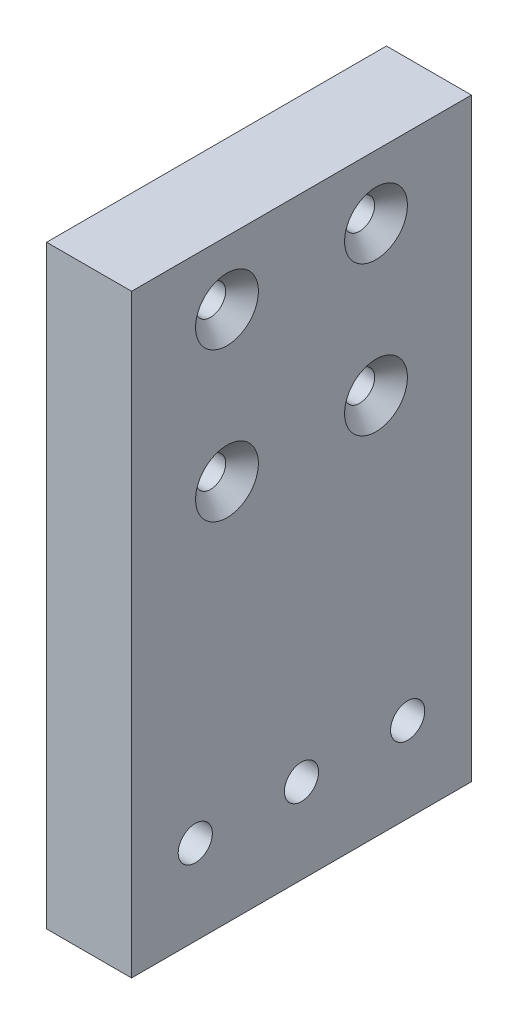
ISO-10303-21;
HEADER;
FILE_DESCRIPTION(('STEP AP214'),'2;1');
FILE_NAME('part.step','',(''),(''),'','','');
FILE_SCHEMA(('AUTOMOTIVE_DESIGN { 1 0 10303 214 1 1 1 1 }'));
ENDSEC;
DATA;
#1=APPLICATION_CONTEXT('core data for automotive mechanical design processes');
#2=APPLICATION_PROTOCOL_DEFINITION('international standard','automotive_design',2000,#1);
#3=PRODUCT_CONTEXT('',#1,'mechanical');
#4=PRODUCT('Part','Part','',(#3));
#5=PRODUCT_RELATED_PRODUCT_CATEGORY('part','',(#4));
#6=PRODUCT_DEFINITION_FORMATION('','',#4);
#7=PRODUCT_DEFINITION_CONTEXT('part definition',#1,'design');
#8=PRODUCT_DEFINITION('design','',#6,#7);
#9=PRODUCT_DEFINITION_SHAPE('','',#8);
#10=(LENGTH_UNIT() NAMED_UNIT(*) SI_UNIT(.MILLI.,.METRE.));
#11=(NAMED_UNIT(*) PLANE_ANGLE_UNIT() SI_UNIT($,.RADIAN.));
#12=(NAMED_UNIT(*) SI_UNIT($,.STERADIAN.) SOLID_ANGLE_UNIT());
#13=UNCERTAINTY_MEASURE_WITH_UNIT(LENGTH_MEASURE(1.E-05),#10,'distance_accuracy_value','');
#14=(GEOMETRIC_REPRESENTATION_CONTEXT(3) GLOBAL_UNCERTAINTY_ASSIGNED_CONTEXT((#13)) GLOBAL_UNIT_ASSIGNED_CONTEXT((#10,
#11,#12)) REPRESENTATION_CONTEXT('',''));
#15=CARTESIAN_POINT('',(0.,0.,0.));
#16=DIRECTION('',(0.,0.,1.));
#17=DIRECTION('',(1.,0.,0.));
#18=AXIS2_PLACEMENT_3D('',#15,#16,#17);
#19=CARTESIAN_POINT('',(12.7,-44.45,-25.4));
#20=DIRECTION('',(0.,0.,1.));
#21=DIRECTION('',(1.,0.,0.));
#22=AXIS2_PLACEMENT_3D('',#19,#20,#21);
#23=PLANE('',#22);
#24=DIRECTION('',(0.,1.,0.));
#25=VECTOR('',#24,1.);
#26=CARTESIAN_POINT('',(0.,-44.45,-25.4));
#27=LINE('',#26,#25);
#28=CARTESIAN_POINT('',(0.,-44.45,-25.4));
#29=VERTEX_POINT('',#28);
#30=CARTESIAN_POINT('',(0.,44.45,-25.4));
#31=VERTEX_POINT('',#30);
#32=EDGE_CURVE('E98',#29,#31,#27,.T.);
#33=ORIENTED_EDGE('',*,*,#32,.T.);
#34=DIRECTION('',(-1.,0.,0.));
#35=VECTOR('',#34,1.);
#36=CARTESIAN_POINT('',(12.7,44.45,-25.4));
#37=LINE('',#36,#35);
#38=CARTESIAN_POINT('',(12.7,44.45,-25.4));
#39=VERTEX_POINT('',#38);
#40=EDGE_CURVE('E11',#39,#31,#37,.T.);
#41=ORIENTED_EDGE('',*,*,#40,.F.);
#42=DIRECTION('',(0.,1.,0.));
#43=VECTOR('',#42,1.);
#44=CARTESIAN_POINT('',(12.7,-44.45,-25.4));
#45=LINE('',#44,#43);
#46=CARTESIAN_POINT('',(12.7,-44.45,-25.4));
#47=VERTEX_POINT('',#46);
#48=EDGE_CURVE('E86',#47,#39,#45,.T.);
#49=ORIENTED_EDGE('',*,*,#48,.F.);
#50=DIRECTION('',(-1.,0.,0.));
#51=VECTOR('',#50,1.);
#52=CARTESIAN_POINT('',(12.7,-44.45,-25.4));
#53=LINE('',#52,#51);
#54=EDGE_CURVE('E94',#47,#29,#53,.T.);
#55=ORIENTED_EDGE('',*,*,#54,.T.);
#56=EDGE_LOOP('',(#33,#41,#49,#55));
#57=FACE_BOUND('',#56,.T.);
#58=ADVANCED_FACE('F35',(#57),#23,.F.);
#59=CARTESIAN_POINT('',(12.7,44.45,25.4));
#60=DIRECTION('',(0.,-1.,0.));
#61=DIRECTION('',(0.,0.,-1.));
#62=AXIS2_PLACEMENT_3D('',#59,#60,#61);
#63=PLANE('',#62);
#64=DIRECTION('',(0.,0.,1.));
#65=VECTOR('',#64,1.);
#66=CARTESIAN_POINT('',(0.,44.45,25.4));
#67=LINE('',#66,#65);
#68=CARTESIAN_POINT('',(0.,44.45,25.4));
#69=VERTEX_POINT('',#68);
#70=EDGE_CURVE('E90',#31,#69,#67,.T.);
#71=ORIENTED_EDGE('',*,*,#70,.T.);
#72=DIRECTION('',(-1.,0.,0.));
#73=VECTOR('',#72,1.);
#74=CARTESIAN_POINT('',(12.7,44.45,25.4));
#75=LINE('',#74,#73);
#76=CARTESIAN_POINT('',(12.7,44.45,25.4));
#77=VERTEX_POINT('',#76);
#78=EDGE_CURVE('E43',#77,#69,#75,.T.);
#79=ORIENTED_EDGE('',*,*,#78,.F.);
#80=DIRECTION('',(0.,0.,1.));
#81=VECTOR('',#80,1.);
#82=CARTESIAN_POINT('',(12.7,44.45,25.4));
#83=LINE('',#82,#81);
#84=EDGE_CURVE('E81',#39,#77,#83,.T.);
#85=ORIENTED_EDGE('',*,*,#84,.F.);
#86=ORIENTED_EDGE('',*,*,#40,.T.);
#87=EDGE_LOOP('',(#71,#79,#85,#86));
#88=FACE_BOUND('',#87,.T.);
#89=ADVANCED_FACE('F89',(#88),#63,.F.);
#90=CARTESIAN_POINT('',(12.7,-44.45,25.4));
#91=DIRECTION('',(0.,0.,-1.));
#92=DIRECTION('',(-1.,0.,0.));
#93=AXIS2_PLACEMENT_3D('',#90,#91,#92);
#94=PLANE('',#93);
#95=DIRECTION('',(0.,-1.,0.));
#96=VECTOR('',#95,1.);
#97=CARTESIAN_POINT('',(0.,-44.45,25.4));
#98=LINE('',#97,#96);
#99=CARTESIAN_POINT('',(0.,-44.45,25.4));
#100=VERTEX_POINT('',#99);
#101=EDGE_CURVE('E68',#69,#100,#98,.T.);
#102=ORIENTED_EDGE('',*,*,#101,.T.);
#103=DIRECTION('',(-1.,0.,0.));
#104=VECTOR('',#103,1.);
#105=CARTESIAN_POINT('',(12.7,-44.45,25.4));
#106=LINE('',#105,#104);
#107=CARTESIAN_POINT('',(12.7,-44.45,25.4));
#108=VERTEX_POINT('',#107);
#109=EDGE_CURVE('E91',#108,#100,#106,.T.);
#110=ORIENTED_EDGE('',*,*,#109,.F.);
#111=DIRECTION('',(0.,-1.,0.));
#112=VECTOR('',#111,1.);
#113=CARTESIAN_POINT('',(12.7,-44.45,25.4));
#114=LINE('',#113,#112);
#115=EDGE_CURVE('E84',#77,#108,#114,.T.);
#116=ORIENTED_EDGE('',*,*,#115,.F.);
#117=ORIENTED_EDGE('',*,*,#78,.T.);
#118=EDGE_LOOP('',(#102,#110,#116,#117));
#119=FACE_BOUND('',#118,.T.);
#120=ADVANCED_FACE('F92',(#119),#94,.F.);
#121=CARTESIAN_POINT('',(12.7,-44.45,25.4));
#122=DIRECTION('',(0.,1.,0.));
#123=DIRECTION('',(0.,0.,1.));
#124=AXIS2_PLACEMENT_3D('',#121,#122,#123);
#125=PLANE('',#124);
#126=DIRECTION('',(0.,0.,-1.));
#127=VECTOR('',#126,1.);
#128=CARTESIAN_POINT('',(0.,-44.45,25.4));
#129=LINE('',#128,#127);
#130=EDGE_CURVE('E74',#100,#29,#129,.T.);
#131=ORIENTED_EDGE('',*,*,#130,.T.);
#132=ORIENTED_EDGE('',*,*,#54,.F.);
#133=DIRECTION('',(0.,0.,-1.));
#134=VECTOR('',#133,1.);
#135=CARTESIAN_POINT('',(12.7,-44.45,25.4));
#136=LINE('',#135,#134);
#137=EDGE_CURVE('E51',#108,#47,#136,.T.);
#138=ORIENTED_EDGE('',*,*,#137,.F.);
#139=ORIENTED_EDGE('',*,*,#109,.T.);
#140=EDGE_LOOP('',(#131,#132,#138,#139));
#141=FACE_BOUND('',#140,.T.);
#142=ADVANCED_FACE('F106',(#141),#125,.F.);
#143=CARTESIAN_POINT('',(12.7,0.,0.));
#144=DIRECTION('',(-1.,0.,0.));
#145=DIRECTION('',(0.,0.,1.));
#146=AXIS2_PLACEMENT_3D('',#143,#144,#145);
#147=PLANE('',#146);
#148=CARTESIAN_POINT('',(12.7,-31.75,-15.875));
#149=DIRECTION('',(-1.,0.,0.));
#150=DIRECTION('',(0.,0.,1.));
#151=AXIS2_PLACEMENT_3D('',#148,#149,#150);
#152=CIRCLE('',#151,2.5527);
#153=CARTESIAN_POINT('',(12.7,-31.75,-13.3223));
#154=VERTEX_POINT('',#153);
#155=EDGE_CURVE('E171',#154,#154,#152,.T.);
#156=ORIENTED_EDGE('',*,*,#155,.T.);
#157=EDGE_LOOP('',(#156));
#158=FACE_BOUND('',#157,.T.);
#159=CARTESIAN_POINT('',(12.7,-31.75,0.));
#160=DIRECTION('',(-1.,0.,0.));
#161=DIRECTION('',(0.,0.,1.));
#162=AXIS2_PLACEMENT_3D('',#159,#160,#161);
#163=CIRCLE('',#162,2.5527);
#164=CARTESIAN_POINT('',(12.7,-31.75,2.5527));
#165=VERTEX_POINT('',#164);
#166=EDGE_CURVE('E159',#165,#165,#163,.T.);
#167=ORIENTED_EDGE('',*,*,#166,.T.);
#168=EDGE_LOOP('',(#167));
#169=FACE_BOUND('',#168,.T.);
#170=CARTESIAN_POINT('',(12.7,-31.75,15.875));
#171=DIRECTION('',(-1.,0.,0.));
#172=DIRECTION('',(0.,0.,1.));
#173=AXIS2_PLACEMENT_3D('',#170,#171,#172);
#174=CIRCLE('',#173,2.5527);
#175=CARTESIAN_POINT('',(12.7,-31.75,18.4277));
#176=VERTEX_POINT('',#175);
#177=EDGE_CURVE('E147',#176,#176,#174,.T.);
#178=ORIENTED_EDGE('',*,*,#177,.T.);
#179=EDGE_LOOP('',(#178));
#180=FACE_BOUND('',#179,.T.);
#181=CARTESIAN_POINT('',(12.7,34.9738636073762,-11.1369318036881));
#182=DIRECTION('',(1.,0.,0.));
#183=DIRECTION('',(0.,0.,-1.));
#184=AXIS2_PLACEMENT_3D('',#181,#182,#183);
#185=CIRCLE('',#184,4.7);
#186=CARTESIAN_POINT('',(12.7,34.9738636073762,-15.8369318036881));
#187=VERTEX_POINT('',#186);
#188=EDGE_CURVE('E144',#187,#187,#185,.T.);
#189=ORIENTED_EDGE('',*,*,#188,.F.);
#190=EDGE_LOOP('',(#189));
#191=FACE_BOUND('',#190,.T.);
#192=CARTESIAN_POINT('',(12.7,34.9738636073762,11.1369318036881));
#193=DIRECTION('',(1.,0.,0.));
#194=DIRECTION('',(0.,0.,-1.));
#195=AXIS2_PLACEMENT_3D('',#192,#193,#194);
#196=CIRCLE('',#195,4.7);
#197=CARTESIAN_POINT('',(12.7,34.9738636073762,6.43693180368812));
#198=VERTEX_POINT('',#197);
#199=EDGE_CURVE('E135',#198,#198,#196,.T.);
#200=ORIENTED_EDGE('',*,*,#199,.F.);
#201=EDGE_LOOP('',(#200));
#202=FACE_BOUND('',#201,.T.);
#203=CARTESIAN_POINT('',(12.7,12.7,11.1369318036881));
#204=DIRECTION('',(1.,0.,0.));
#205=DIRECTION('',(0.,0.,-1.));
#206=AXIS2_PLACEMENT_3D('',#203,#204,#205);
#207=CIRCLE('',#206,4.7);
#208=CARTESIAN_POINT('',(12.7,12.7,6.43693180368812));
#209=VERTEX_POINT('',#208);
#210=EDGE_CURVE('E126',#209,#209,#207,.T.);
#211=ORIENTED_EDGE('',*,*,#210,.F.);
#212=EDGE_LOOP('',(#211));
#213=FACE_BOUND('',#212,.T.);
#214=CARTESIAN_POINT('',(12.7,12.7,-11.1369318036881));
#215=DIRECTION('',(1.,0.,0.));
#216=DIRECTION('',(0.,0.,-1.));
#217=AXIS2_PLACEMENT_3D('',#214,#215,#216);
#218=CIRCLE('',#217,4.7);
#219=CARTESIAN_POINT('',(12.7,12.7,-15.8369318036881));
#220=VERTEX_POINT('',#219);
#221=EDGE_CURVE('E117',#220,#220,#218,.T.);
#222=ORIENTED_EDGE('',*,*,#221,.F.);
#223=EDGE_LOOP('',(#222));
#224=FACE_BOUND('',#223,.T.);
#225=ORIENTED_EDGE('',*,*,#48,.T.);
#226=ORIENTED_EDGE('',*,*,#84,.T.);
#227=ORIENTED_EDGE('',*,*,#115,.T.);
#228=ORIENTED_EDGE('',*,*,#137,.T.);
#229=EDGE_LOOP('',(#225,#226,#227,#228));
#230=FACE_BOUND('',#229,.T.);
#231=ADVANCED_FACE('F82',(#158,#169,#180,#191,#202,#213,#224,#230),#147,.F.);
#232=CARTESIAN_POINT('',(0.,0.,0.));
#233=DIRECTION('',(-1.,0.,0.));
#234=DIRECTION('',(0.,0.,1.));
#235=AXIS2_PLACEMENT_3D('',#232,#233,#234);
#236=PLANE('',#235);
#237=CARTESIAN_POINT('',(0.,-31.75,-15.875));
#238=DIRECTION('',(-1.,0.,0.));
#239=DIRECTION('',(0.,0.,1.));
#240=AXIS2_PLACEMENT_3D('',#237,#238,#239);
#241=CIRCLE('',#240,4.7625);
#242=CARTESIAN_POINT('',(0.,-31.75,-11.1125));
#243=VERTEX_POINT('',#242);
#244=EDGE_CURVE('E180',#243,#243,#241,.T.);
#245=ORIENTED_EDGE('',*,*,#244,.F.);
#246=EDGE_LOOP('',(#245));
#247=FACE_BOUND('',#246,.T.);
#248=CARTESIAN_POINT('',(0.,-31.75,0.));
#249=DIRECTION('',(-1.,0.,0.));
#250=DIRECTION('',(0.,0.,1.));
#251=AXIS2_PLACEMENT_3D('',#248,#249,#250);
#252=CIRCLE('',#251,4.7625);
#253=CARTESIAN_POINT('',(0.,-31.75,4.7625));
#254=VERTEX_POINT('',#253);
#255=EDGE_CURVE('E168',#254,#254,#252,.T.);
#256=ORIENTED_EDGE('',*,*,#255,.F.);
#257=EDGE_LOOP('',(#256));
#258=FACE_BOUND('',#257,.T.);
#259=CARTESIAN_POINT('',(0.,-31.75,15.875));
#260=DIRECTION('',(-1.,0.,0.));
#261=DIRECTION('',(0.,0.,1.));
#262=AXIS2_PLACEMENT_3D('',#259,#260,#261);
#263=CIRCLE('',#262,4.7625);
#264=CARTESIAN_POINT('',(0.,-31.75,20.6375));
#265=VERTEX_POINT('',#264);
#266=EDGE_CURVE('E156',#265,#265,#263,.T.);
#267=ORIENTED_EDGE('',*,*,#266,.F.);
#268=EDGE_LOOP('',(#267));
#269=FACE_BOUND('',#268,.T.);
#270=CARTESIAN_POINT('',(0.,34.9738636073762,-11.1369318036881));
#271=DIRECTION('',(1.,0.,0.));
#272=DIRECTION('',(0.,0.,-1.));
#273=AXIS2_PLACEMENT_3D('',#270,#271,#272);
#274=CIRCLE('',#273,2.25);
#275=CARTESIAN_POINT('',(0.,34.9738636073762,-13.3869318036881));
#276=VERTEX_POINT('',#275);
#277=EDGE_CURVE('E138',#276,#276,#274,.T.);
#278=ORIENTED_EDGE('',*,*,#277,.T.);
#279=EDGE_LOOP('',(#278));
#280=FACE_BOUND('',#279,.T.);
#281=CARTESIAN_POINT('',(0.,34.9738636073762,11.1369318036881));
#282=DIRECTION('',(1.,0.,0.));
#283=DIRECTION('',(0.,0.,-1.));
#284=AXIS2_PLACEMENT_3D('',#281,#282,#283);
#285=CIRCLE('',#284,2.25);
#286=CARTESIAN_POINT('',(0.,34.9738636073762,8.88693180368813));
#287=VERTEX_POINT('',#286);
#288=EDGE_CURVE('E129',#287,#287,#285,.T.);
#289=ORIENTED_EDGE('',*,*,#288,.T.);
#290=EDGE_LOOP('',(#289));
#291=FACE_BOUND('',#290,.T.);
#292=CARTESIAN_POINT('',(0.,12.7,11.1369318036881));
#293=DIRECTION('',(1.,0.,0.));
#294=DIRECTION('',(0.,0.,-1.));
#295=AXIS2_PLACEMENT_3D('',#292,#293,#294);
#296=CIRCLE('',#295,2.25);
#297=CARTESIAN_POINT('',(0.,12.7,8.88693180368813));
#298=VERTEX_POINT('',#297);
#299=EDGE_CURVE('E120',#298,#298,#296,.T.);
#300=ORIENTED_EDGE('',*,*,#299,.T.);
#301=EDGE_LOOP('',(#300));
#302=FACE_BOUND('',#301,.T.);
#303=CARTESIAN_POINT('',(0.,12.7,-11.1369318036881));
#304=DIRECTION('',(1.,0.,0.));
#305=DIRECTION('',(0.,0.,-1.));
#306=AXIS2_PLACEMENT_3D('',#303,#304,#305);
#307=CIRCLE('',#306,2.25);
#308=CARTESIAN_POINT('',(0.,12.7,-13.3869318036881));
#309=VERTEX_POINT('',#308);
#310=EDGE_CURVE('E101',#309,#309,#307,.T.);
#311=ORIENTED_EDGE('',*,*,#310,.T.);
#312=EDGE_LOOP('',(#311));
#313=FACE_BOUND('',#312,.T.);
#314=ORIENTED_EDGE('',*,*,#32,.F.);
#315=ORIENTED_EDGE('',*,*,#130,.F.);
#316=ORIENTED_EDGE('',*,*,#101,.F.);
#317=ORIENTED_EDGE('',*,*,#70,.F.);
#318=EDGE_LOOP('',(#314,#315,#316,#317));
#319=FACE_BOUND('',#318,.T.);
#320=ADVANCED_FACE('F109',(#247,#258,#269,#280,#291,#302,#313,#319),#236,.T.);
#321=CARTESIAN_POINT('',(12.7,12.7,-11.1369318036881));
#322=DIRECTION('',(1.,0.,0.));
#323=DIRECTION('',(0.,0.,-1.));
#324=AXIS2_PLACEMENT_3D('',#321,#322,#323);
#325=CYLINDRICAL_SURFACE('',#324,2.25);
#326=ORIENTED_EDGE('',*,*,#310,.F.);
#327=EDGE_LOOP('',(#326));
#328=FACE_BOUND('',#327,.T.);
#329=CARTESIAN_POINT('',(10.25,12.7,-11.1369318036881));
#330=DIRECTION('',(1.,0.,0.));
#331=DIRECTION('',(0.,0.,-1.));
#332=AXIS2_PLACEMENT_3D('',#329,#330,#331);
#333=CIRCLE('',#332,2.25);
#334=CARTESIAN_POINT('',(10.25,12.7,-13.3869318036881));
#335=VERTEX_POINT('',#334);
#336=EDGE_CURVE('E114',#335,#335,#333,.T.);
#337=ORIENTED_EDGE('',*,*,#336,.T.);
#338=EDGE_LOOP('',(#337));
#339=FACE_BOUND('',#338,.T.);
#340=ADVANCED_FACE('F188',(#328,#339),#325,.F.);
#341=CARTESIAN_POINT('',(12.7,12.7,-11.1369318036881));
#342=DIRECTION('',(1.,0.,0.));
#343=DIRECTION('',(0.,0.,-1.));
#344=AXIS2_PLACEMENT_3D('',#341,#342,#343);
#345=CONICAL_SURFACE('',#344,4.7,0.785398163397448);
#346=ORIENTED_EDGE('',*,*,#336,.F.);
#347=EDGE_LOOP('',(#346));
#348=FACE_BOUND('',#347,.T.);
#349=ORIENTED_EDGE('',*,*,#221,.T.);
#350=EDGE_LOOP('',(#349));
#351=FACE_BOUND('',#350,.T.);
#352=ADVANCED_FACE('F204',(#348,#351),#345,.F.);
#353=CARTESIAN_POINT('',(12.7,12.7,11.1369318036881));
#354=DIRECTION('',(1.,0.,0.));
#355=DIRECTION('',(0.,0.,-1.));
#356=AXIS2_PLACEMENT_3D('',#353,#354,#355);
#357=CYLINDRICAL_SURFACE('',#356,2.25);
#358=ORIENTED_EDGE('',*,*,#299,.F.);
#359=EDGE_LOOP('',(#358));
#360=FACE_BOUND('',#359,.T.);
#361=CARTESIAN_POINT('',(10.25,12.7,11.1369318036881));
#362=DIRECTION('',(1.,0.,0.));
#363=DIRECTION('',(0.,0.,-1.));
#364=AXIS2_PLACEMENT_3D('',#361,#362,#363);
#365=CIRCLE('',#364,2.25);
#366=CARTESIAN_POINT('',(10.25,12.7,8.88693180368812));
#367=VERTEX_POINT('',#366);
#368=EDGE_CURVE('E123',#367,#367,#365,.T.);
#369=ORIENTED_EDGE('',*,*,#368,.T.);
#370=EDGE_LOOP('',(#369));
#371=FACE_BOUND('',#370,.T.);
#372=ADVANCED_FACE('F210',(#360,#371),#357,.F.);
#373=CARTESIAN_POINT('',(12.7,12.7,11.1369318036881));
#374=DIRECTION('',(1.,0.,0.));
#375=DIRECTION('',(0.,0.,-1.));
#376=AXIS2_PLACEMENT_3D('',#373,#374,#375);
#377=CONICAL_SURFACE('',#376,4.7,0.785398163397448);
#378=ORIENTED_EDGE('',*,*,#368,.F.);
#379=EDGE_LOOP('',(#378));
#380=FACE_BOUND('',#379,.T.);
#381=ORIENTED_EDGE('',*,*,#210,.T.);
#382=EDGE_LOOP('',(#381));
#383=FACE_BOUND('',#382,.T.);
#384=ADVANCED_FACE('F259',(#380,#383),#377,.F.);
#385=CARTESIAN_POINT('',(12.7,34.9738636073762,11.1369318036881));
#386=DIRECTION('',(1.,0.,0.));
#387=DIRECTION('',(0.,0.,-1.));
#388=AXIS2_PLACEMENT_3D('',#385,#386,#387);
#389=CYLINDRICAL_SURFACE('',#388,2.25);
#390=ORIENTED_EDGE('',*,*,#288,.F.);
#391=EDGE_LOOP('',(#390));
#392=FACE_BOUND('',#391,.T.);
#393=CARTESIAN_POINT('',(10.25,34.9738636073762,11.1369318036881));
#394=DIRECTION('',(1.,0.,0.));
#395=DIRECTION('',(0.,0.,-1.));
#396=AXIS2_PLACEMENT_3D('',#393,#394,#395);
#397=CIRCLE('',#396,2.25);
#398=CARTESIAN_POINT('',(10.25,34.9738636073762,8.88693180368813));
#399=VERTEX_POINT('',#398);
#400=EDGE_CURVE('E132',#399,#399,#397,.T.);
#401=ORIENTED_EDGE('',*,*,#400,.T.);
#402=EDGE_LOOP('',(#401));
#403=FACE_BOUND('',#402,.T.);
#404=ADVANCED_FACE('F269',(#392,#403),#389,.F.);
#405=CARTESIAN_POINT('',(12.7,34.9738636073762,11.1369318036881));
#406=DIRECTION('',(1.,0.,0.));
#407=DIRECTION('',(0.,0.,-1.));
#408=AXIS2_PLACEMENT_3D('',#405,#406,#407);
#409=CONICAL_SURFACE('',#408,4.7,0.785398163397449);
#410=ORIENTED_EDGE('',*,*,#400,.F.);
#411=EDGE_LOOP('',(#410));
#412=FACE_BOUND('',#411,.T.);
#413=ORIENTED_EDGE('',*,*,#199,.T.);
#414=EDGE_LOOP('',(#413));
#415=FACE_BOUND('',#414,.T.);
#416=ADVANCED_FACE('F279',(#412,#415),#409,.F.);
#417=CARTESIAN_POINT('',(12.7,34.9738636073762,-11.1369318036881));
#418=DIRECTION('',(1.,0.,0.));
#419=DIRECTION('',(0.,0.,-1.));
#420=AXIS2_PLACEMENT_3D('',#417,#418,#419);
#421=CYLINDRICAL_SURFACE('',#420,2.25);
#422=ORIENTED_EDGE('',*,*,#277,.F.);
#423=EDGE_LOOP('',(#422));
#424=FACE_BOUND('',#423,.T.);
#425=CARTESIAN_POINT('',(10.25,34.9738636073762,-11.1369318036881));
#426=DIRECTION('',(1.,0.,0.));
#427=DIRECTION('',(0.,0.,-1.));
#428=AXIS2_PLACEMENT_3D('',#425,#426,#427);
#429=CIRCLE('',#428,2.25);
#430=CARTESIAN_POINT('',(10.25,34.9738636073762,-13.3869318036881));
#431=VERTEX_POINT('',#430);
#432=EDGE_CURVE('E141',#431,#431,#429,.T.);
#433=ORIENTED_EDGE('',*,*,#432,.T.);
#434=EDGE_LOOP('',(#433));
#435=FACE_BOUND('',#434,.T.);
#436=ADVANCED_FACE('F289',(#424,#435),#421,.F.);
#437=CARTESIAN_POINT('',(12.7,34.9738636073762,-11.1369318036881));
#438=DIRECTION('',(1.,0.,0.));
#439=DIRECTION('',(0.,0.,-1.));
#440=AXIS2_PLACEMENT_3D('',#437,#438,#439);
#441=CONICAL_SURFACE('',#440,4.7,0.785398163397449);
#442=ORIENTED_EDGE('',*,*,#432,.F.);
#443=EDGE_LOOP('',(#442));
#444=FACE_BOUND('',#443,.T.);
#445=ORIENTED_EDGE('',*,*,#188,.T.);
#446=EDGE_LOOP('',(#445));
#447=FACE_BOUND('',#446,.T.);
#448=ADVANCED_FACE('F299',(#444,#447),#441,.F.);
#449=CARTESIAN_POINT('',(0.,-31.75,15.875));
#450=DIRECTION('',(-1.,0.,0.));
#451=DIRECTION('',(0.,0.,1.));
#452=AXIS2_PLACEMENT_3D('',#449,#450,#451);
#453=CYLINDRICAL_SURFACE('',#452,2.5527);
#454=ORIENTED_EDGE('',*,*,#177,.F.);
#455=EDGE_LOOP('',(#454));
#456=FACE_BOUND('',#455,.T.);
#457=CARTESIAN_POINT('',(4.826,-31.75,15.875));
#458=DIRECTION('',(-1.,0.,0.));
#459=DIRECTION('',(0.,0.,1.));
#460=AXIS2_PLACEMENT_3D('',#457,#458,#459);
#461=CIRCLE('',#460,2.5527);
#462=CARTESIAN_POINT('',(4.826,-31.75,18.4277));
#463=VERTEX_POINT('',#462);
#464=EDGE_CURVE('E150',#463,#463,#461,.T.);
#465=ORIENTED_EDGE('',*,*,#464,.T.);
#466=EDGE_LOOP('',(#465));
#467=FACE_BOUND('',#466,.T.);
#468=ADVANCED_FACE('F308',(#456,#467),#453,.F.);
#469=CARTESIAN_POINT('',(4.826,-29.1973,15.875));
#470=DIRECTION('',(1.,0.,0.));
#471=DIRECTION('',(0.,0.,-1.));
#472=AXIS2_PLACEMENT_3D('',#469,#470,#471);
#473=PLANE('',#472);
#474=ORIENTED_EDGE('',*,*,#464,.F.);
#475=EDGE_LOOP('',(#474));
#476=FACE_BOUND('',#475,.T.);
#477=CARTESIAN_POINT('',(4.826,-31.75,15.875));
#478=DIRECTION('',(-1.,0.,0.));
#479=DIRECTION('',(0.,0.,1.));
#480=AXIS2_PLACEMENT_3D('',#477,#478,#479);
#481=CIRCLE('',#480,4.7625);
#482=CARTESIAN_POINT('',(4.826,-31.75,20.6375));
#483=VERTEX_POINT('',#482);
#484=EDGE_CURVE('E153',#483,#483,#481,.T.);
#485=ORIENTED_EDGE('',*,*,#484,.T.);
#486=EDGE_LOOP('',(#485));
#487=FACE_BOUND('',#486,.T.);
#488=ADVANCED_FACE('F327',(#476,#487),#473,.F.);
#489=CARTESIAN_POINT('',(0.,-31.75,15.875));
#490=DIRECTION('',(-1.,0.,0.));
#491=DIRECTION('',(0.,0.,1.));
#492=AXIS2_PLACEMENT_3D('',#489,#490,#491);
#493=CYLINDRICAL_SURFACE('',#492,4.7625);
#494=ORIENTED_EDGE('',*,*,#484,.F.);
#495=EDGE_LOOP('',(#494));
#496=FACE_BOUND('',#495,.T.);
#497=ORIENTED_EDGE('',*,*,#266,.T.);
#498=EDGE_LOOP('',(#497));
#499=FACE_BOUND('',#498,.T.);
#500=ADVANCED_FACE('F337',(#496,#499),#493,.F.);
#501=CARTESIAN_POINT('',(0.,-31.75,0.));
#502=DIRECTION('',(-1.,0.,0.));
#503=DIRECTION('',(0.,0.,1.));
#504=AXIS2_PLACEMENT_3D('',#501,#502,#503);
#505=CYLINDRICAL_SURFACE('',#504,2.5527);
#506=ORIENTED_EDGE('',*,*,#166,.F.);
#507=EDGE_LOOP('',(#506));
#508=FACE_BOUND('',#507,.T.);
#509=CARTESIAN_POINT('',(4.826,-31.75,0.));
#510=DIRECTION('',(-1.,0.,0.));
#511=DIRECTION('',(0.,0.,1.));
#512=AXIS2_PLACEMENT_3D('',#509,#510,#511);
#513=CIRCLE('',#512,2.5527);
#514=CARTESIAN_POINT('',(4.826,-31.75,2.5527));
#515=VERTEX_POINT('',#514);
#516=EDGE_CURVE('E162',#515,#515,#513,.T.);
#517=ORIENTED_EDGE('',*,*,#516,.T.);
#518=EDGE_LOOP('',(#517));
#519=FACE_BOUND('',#518,.T.);
#520=ADVANCED_FACE('F347',(#508,#519),#505,.F.);
#521=CARTESIAN_POINT('',(4.826,-29.1973,0.));
#522=DIRECTION('',(1.,0.,0.));
#523=DIRECTION('',(0.,0.,-1.));
#524=AXIS2_PLACEMENT_3D('',#521,#522,#523);
#525=PLANE('',#524);
#526=ORIENTED_EDGE('',*,*,#516,.F.);
#527=EDGE_LOOP('',(#526));
#528=FACE_BOUND('',#527,.T.);
#529=CARTESIAN_POINT('',(4.826,-31.75,0.));
#530=DIRECTION('',(-1.,0.,0.));
#531=DIRECTION('',(0.,0.,1.));
#532=AXIS2_PLACEMENT_3D('',#529,#530,#531);
#533=CIRCLE('',#532,4.7625);
#534=CARTESIAN_POINT('',(4.826,-31.75,4.7625));
#535=VERTEX_POINT('',#534);
#536=EDGE_CURVE('E165',#535,#535,#533,.T.);
#537=ORIENTED_EDGE('',*,*,#536,.T.);
#538=EDGE_LOOP('',(#537));
#539=FACE_BOUND('',#538,.T.);
#540=ADVANCED_FACE('F357',(#528,#539),#525,.F.);
#541=CARTESIAN_POINT('',(0.,-31.75,0.));
#542=DIRECTION('',(-1.,0.,0.));
#543=DIRECTION('',(0.,0.,1.));
#544=AXIS2_PLACEMENT_3D('',#541,#542,#543);
#545=CYLINDRICAL_SURFACE('',#544,4.7625);
#546=ORIENTED_EDGE('',*,*,#536,.F.);
#547=EDGE_LOOP('',(#546));
#548=FACE_BOUND('',#547,.T.);
#549=ORIENTED_EDGE('',*,*,#255,.T.);
#550=EDGE_LOOP('',(#549));
#551=FACE_BOUND('',#550,.T.);
#552=ADVANCED_FACE('F367',(#548,#551),#545,.F.);
#553=CARTESIAN_POINT('',(0.,-31.75,-15.875));
#554=DIRECTION('',(-1.,0.,0.));
#555=DIRECTION('',(0.,0.,1.));
#556=AXIS2_PLACEMENT_3D('',#553,#554,#555);
#557=CYLINDRICAL_SURFACE('',#556,2.5527);
#558=ORIENTED_EDGE('',*,*,#155,.F.);
#559=EDGE_LOOP('',(#558));
#560=FACE_BOUND('',#559,.T.);
#561=CARTESIAN_POINT('',(4.826,-31.75,-15.875));
#562=DIRECTION('',(-1.,0.,0.));
#563=DIRECTION('',(0.,0.,1.));
#564=AXIS2_PLACEMENT_3D('',#561,#562,#563);
#565=CIRCLE('',#564,2.5527);
#566=CARTESIAN_POINT('',(4.826,-31.75,-13.3223));
#567=VERTEX_POINT('',#566);
#568=EDGE_CURVE('E174',#567,#567,#565,.T.);
#569=ORIENTED_EDGE('',*,*,#568,.T.);
#570=EDGE_LOOP('',(#569));
#571=FACE_BOUND('',#570,.T.);
#572=ADVANCED_FACE('F377',(#560,#571),#557,.F.);
#573=CARTESIAN_POINT('',(4.826,-29.1973,-15.875));
#574=DIRECTION('',(1.,0.,0.));
#575=DIRECTION('',(0.,0.,-1.));
#576=AXIS2_PLACEMENT_3D('',#573,#574,#575);
#577=PLANE('',#576);
#578=ORIENTED_EDGE('',*,*,#568,.F.);
#579=EDGE_LOOP('',(#578));
#580=FACE_BOUND('',#579,.T.);
#581=CARTESIAN_POINT('',(4.826,-31.75,-15.875));
#582=DIRECTION('',(-1.,0.,0.));
#583=DIRECTION('',(0.,0.,1.));
#584=AXIS2_PLACEMENT_3D('',#581,#582,#583);
#585=CIRCLE('',#584,4.7625);
#586=CARTESIAN_POINT('',(4.826,-31.75,-11.1125));
#587=VERTEX_POINT('',#586);
#588=EDGE_CURVE('E177',#587,#587,#585,.T.);
#589=ORIENTED_EDGE('',*,*,#588,.T.);
#590=EDGE_LOOP('',(#589));
#591=FACE_BOUND('',#590,.T.);
#592=ADVANCED_FACE('F387',(#580,#591),#577,.F.);
#593=CARTESIAN_POINT('',(0.,-31.75,-15.875));
#594=DIRECTION('',(-1.,0.,0.));
#595=DIRECTION('',(0.,0.,1.));
#596=AXIS2_PLACEMENT_3D('',#593,#594,#595);
#597=CYLINDRICAL_SURFACE('',#596,4.7625);
#598=ORIENTED_EDGE('',*,*,#588,.F.);
#599=EDGE_LOOP('',(#598));
#600=FACE_BOUND('',#599,.T.);
#601=ORIENTED_EDGE('',*,*,#244,.T.);
#602=EDGE_LOOP('',(#601));
#603=FACE_BOUND('',#602,.T.);
#604=ADVANCED_FACE('F184',(#600,#603),#597,.F.);
#605=CLOSED_SHELL('',(#58,#89,#120,#142,#231,#320,#340,#352,#372,#384,#404,#416,#436,#448,#468,
#488,#500,#520,#540,#552,#572,#592,#604));
#606=MANIFOLD_SOLID_BREP('B2',#605);
#607=ADVANCED_BREP_SHAPE_REPRESENTATION('',(#18,#606),#14);
#608=SHAPE_DEFINITION_REPRESENTATION(#9,#607);
ENDSEC;
END-ISO-10303-21;
